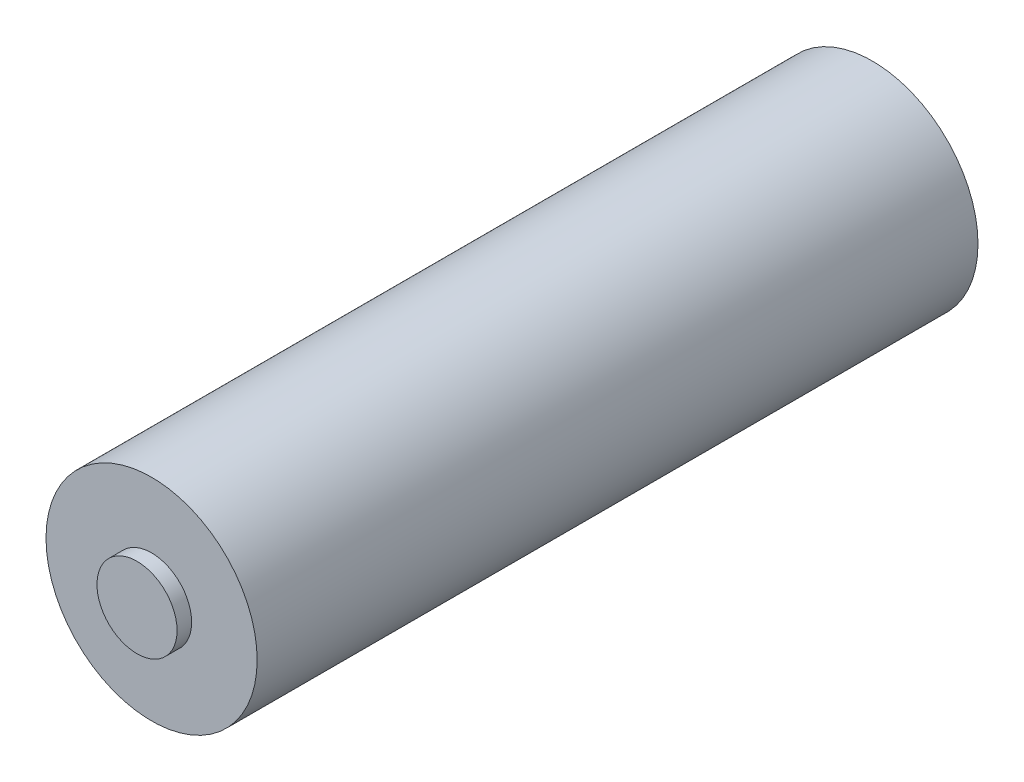
ISO-10303-21;
HEADER;
FILE_DESCRIPTION(('STEP AP214'),'2;1');
FILE_NAME('part.step','',(''),(''),'','','');
FILE_SCHEMA(('AUTOMOTIVE_DESIGN { 1 0 10303 214 1 1 1 1 }'));
ENDSEC;
DATA;
#1=APPLICATION_CONTEXT('core data for automotive mechanical design processes');
#2=APPLICATION_PROTOCOL_DEFINITION('international standard','automotive_design',2000,#1);
#3=PRODUCT_CONTEXT('',#1,'mechanical');
#4=PRODUCT('Part','Part','',(#3));
#5=PRODUCT_RELATED_PRODUCT_CATEGORY('part','',(#4));
#6=PRODUCT_DEFINITION_FORMATION('','',#4);
#7=PRODUCT_DEFINITION_CONTEXT('part definition',#1,'design');
#8=PRODUCT_DEFINITION('design','',#6,#7);
#9=PRODUCT_DEFINITION_SHAPE('','',#8);
#10=(LENGTH_UNIT() NAMED_UNIT(*) SI_UNIT(.MILLI.,.METRE.));
#11=(NAMED_UNIT(*) PLANE_ANGLE_UNIT() SI_UNIT($,.RADIAN.));
#12=(NAMED_UNIT(*) SI_UNIT($,.STERADIAN.) SOLID_ANGLE_UNIT());
#13=UNCERTAINTY_MEASURE_WITH_UNIT(LENGTH_MEASURE(1.E-05),#10,'distance_accuracy_value','');
#14=(GEOMETRIC_REPRESENTATION_CONTEXT(3) GLOBAL_UNCERTAINTY_ASSIGNED_CONTEXT((#13)) GLOBAL_UNIT_ASSIGNED_CONTEXT((#10,
#11,#12)) REPRESENTATION_CONTEXT('',''));
#15=CARTESIAN_POINT('',(0.,0.,0.));
#16=DIRECTION('',(0.,0.,1.));
#17=DIRECTION('',(1.,0.,0.));
#18=AXIS2_PLACEMENT_3D('',#15,#16,#17);
#19=CARTESIAN_POINT('',(0.,0.,49.5));
#20=DIRECTION('',(0.,0.,1.));
#21=DIRECTION('',(1.,0.,0.));
#22=AXIS2_PLACEMENT_3D('',#19,#20,#21);
#23=PLANE('',#22);
#24=CARTESIAN_POINT('',(0.,0.,49.5));
#25=DIRECTION('',(0.,0.,1.));
#26=DIRECTION('',(1.,0.,0.));
#27=AXIS2_PLACEMENT_3D('',#24,#25,#26);
#28=CIRCLE('',#27,7.25);
#29=CARTESIAN_POINT('',(7.25,0.,49.5));
#30=VERTEX_POINT('',#29);
#31=EDGE_CURVE('E10',#30,#30,#28,.T.);
#32=ORIENTED_EDGE('',*,*,#31,.T.);
#33=EDGE_LOOP('',(#32));
#34=FACE_BOUND('',#33,.T.);
#35=CARTESIAN_POINT('',(0.,0.,49.5));
#36=DIRECTION('',(0.,0.,1.));
#37=DIRECTION('',(1.,0.,0.));
#38=AXIS2_PLACEMENT_3D('',#35,#36,#37);
#39=CIRCLE('',#38,2.75);
#40=CARTESIAN_POINT('',(2.75,0.,49.5));
#41=VERTEX_POINT('',#40);
#42=EDGE_CURVE('E50',#41,#41,#39,.T.);
#43=ORIENTED_EDGE('',*,*,#42,.F.);
#44=EDGE_LOOP('',(#43));
#45=FACE_BOUND('',#44,.T.);
#46=ADVANCED_FACE('F37',(#34,#45),#23,.T.);
#47=CARTESIAN_POINT('',(0.,0.,0.));
#48=DIRECTION('',(0.,0.,1.));
#49=DIRECTION('',(1.,0.,0.));
#50=AXIS2_PLACEMENT_3D('',#47,#48,#49);
#51=PLANE('',#50);
#52=CARTESIAN_POINT('',(0.,0.,0.));
#53=DIRECTION('',(0.,0.,1.));
#54=DIRECTION('',(1.,0.,0.));
#55=AXIS2_PLACEMENT_3D('',#52,#53,#54);
#56=CIRCLE('',#55,7.25);
#57=CARTESIAN_POINT('',(7.25,0.,0.));
#58=VERTEX_POINT('',#57);
#59=EDGE_CURVE('E41',#58,#58,#56,.T.);
#60=ORIENTED_EDGE('',*,*,#59,.F.);
#61=EDGE_LOOP('',(#60));
#62=FACE_BOUND('',#61,.T.);
#63=ADVANCED_FACE('F70',(#62),#51,.F.);
#64=CARTESIAN_POINT('',(0.,0.,49.5));
#65=DIRECTION('',(0.,0.,-1.));
#66=DIRECTION('',(-1.,0.,0.));
#67=AXIS2_PLACEMENT_3D('',#64,#65,#66);
#68=CYLINDRICAL_SURFACE('',#67,7.25);
#69=ORIENTED_EDGE('',*,*,#31,.F.);
#70=EDGE_LOOP('',(#69));
#71=FACE_BOUND('',#70,.T.);
#72=ORIENTED_EDGE('',*,*,#59,.T.);
#73=EDGE_LOOP('',(#72));
#74=FACE_BOUND('',#73,.T.);
#75=ADVANCED_FACE('F39',(#71,#74),#68,.T.);
#76=CARTESIAN_POINT('',(0.,0.,50.5));
#77=DIRECTION('',(0.,0.,-1.));
#78=DIRECTION('',(-1.,0.,0.));
#79=AXIS2_PLACEMENT_3D('',#76,#77,#78);
#80=CYLINDRICAL_SURFACE('',#79,2.75);
#81=ORIENTED_EDGE('',*,*,#42,.T.);
#82=EDGE_LOOP('',(#81));
#83=FACE_BOUND('',#82,.T.);
#84=CARTESIAN_POINT('',(0.,0.,50.5));
#85=DIRECTION('',(0.,0.,1.));
#86=DIRECTION('',(1.,0.,0.));
#87=AXIS2_PLACEMENT_3D('',#84,#85,#86);
#88=CIRCLE('',#87,2.75);
#89=CARTESIAN_POINT('',(2.75,0.,50.5));
#90=VERTEX_POINT('',#89);
#91=EDGE_CURVE('E54',#90,#90,#88,.T.);
#92=ORIENTED_EDGE('',*,*,#91,.F.);
#93=EDGE_LOOP('',(#92));
#94=FACE_BOUND('',#93,.T.);
#95=ADVANCED_FACE('F61',(#83,#94),#80,.T.);
#96=CARTESIAN_POINT('',(0.,0.,50.5));
#97=DIRECTION('',(0.,0.,1.));
#98=DIRECTION('',(1.,0.,0.));
#99=AXIS2_PLACEMENT_3D('',#96,#97,#98);
#100=PLANE('',#99);
#101=ORIENTED_EDGE('',*,*,#91,.T.);
#102=EDGE_LOOP('',(#101));
#103=FACE_BOUND('',#102,.T.);
#104=ADVANCED_FACE('F59',(#103),#100,.T.);
#105=CLOSED_SHELL('',(#46,#63,#75,#95,#104));
#106=MANIFOLD_SOLID_BREP('B2',#105);
#107=ADVANCED_BREP_SHAPE_REPRESENTATION('',(#18,#106),#14);
#108=SHAPE_DEFINITION_REPRESENTATION(#9,#107);
ENDSEC;
END-ISO-10303-21;
